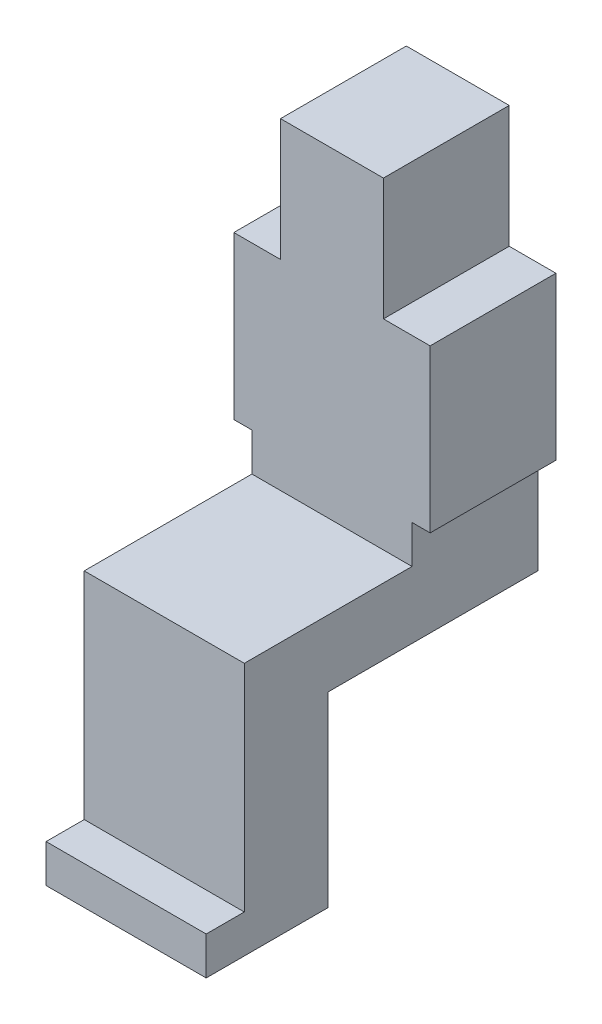
ISO-10303-21;
HEADER;
FILE_DESCRIPTION(('STEP AP214'),'2;1');
FILE_NAME('part.step','',(''),(''),'','','');
FILE_SCHEMA(('AUTOMOTIVE_DESIGN { 1 0 10303 214 1 1 1 1 }'));
ENDSEC;
DATA;
#1=APPLICATION_CONTEXT('core data for automotive mechanical design processes');
#2=APPLICATION_PROTOCOL_DEFINITION('international standard','automotive_design',2000,#1);
#3=PRODUCT_CONTEXT('',#1,'mechanical');
#4=PRODUCT('Part','Part','',(#3));
#5=PRODUCT_RELATED_PRODUCT_CATEGORY('part','',(#4));
#6=PRODUCT_DEFINITION_FORMATION('','',#4);
#7=PRODUCT_DEFINITION_CONTEXT('part definition',#1,'design');
#8=PRODUCT_DEFINITION('design','',#6,#7);
#9=PRODUCT_DEFINITION_SHAPE('','',#8);
#10=(LENGTH_UNIT() NAMED_UNIT(*) SI_UNIT(.MILLI.,.METRE.));
#11=(NAMED_UNIT(*) PLANE_ANGLE_UNIT() SI_UNIT($,.RADIAN.));
#12=(NAMED_UNIT(*) SI_UNIT($,.STERADIAN.) SOLID_ANGLE_UNIT());
#13=UNCERTAINTY_MEASURE_WITH_UNIT(LENGTH_MEASURE(1.E-05),#10,'distance_accuracy_value','');
#14=(GEOMETRIC_REPRESENTATION_CONTEXT(3) GLOBAL_UNCERTAINTY_ASSIGNED_CONTEXT((#13)) GLOBAL_UNIT_ASSIGNED_CONTEXT((#10,
#11,#12)) REPRESENTATION_CONTEXT('',''));
#15=CARTESIAN_POINT('',(0.,0.,0.));
#16=DIRECTION('',(0.,0.,1.));
#17=DIRECTION('',(1.,0.,0.));
#18=AXIS2_PLACEMENT_3D('',#15,#16,#17);
#19=CARTESIAN_POINT('',(210.,44.9999999999999,560.));
#20=DIRECTION('',(0.,0.,-1.));
#21=DIRECTION('',(-1.,0.,0.));
#22=AXIS2_PLACEMENT_3D('',#19,#20,#21);
#23=PLANE('',#22);
#24=DIRECTION('',(-1.,0.,0.));
#25=VECTOR('',#24,1.);
#26=CARTESIAN_POINT('',(-210.,-520.,560.));
#27=LINE('',#26,#25);
#28=CARTESIAN_POINT('',(210.,-520.,560.));
#29=VERTEX_POINT('',#28);
#30=CARTESIAN_POINT('',(-210.,-520.,560.));
#31=VERTEX_POINT('',#30);
#32=EDGE_CURVE('E50',#29,#31,#27,.T.);
#33=ORIENTED_EDGE('',*,*,#32,.F.);
#34=DIRECTION('',(0.,-1.,0.));
#35=VECTOR('',#34,1.);
#36=CARTESIAN_POINT('',(210.,44.9999999999999,560.));
#37=LINE('',#36,#35);
#38=CARTESIAN_POINT('',(210.,44.9999999999999,560.));
#39=VERTEX_POINT('',#38);
#40=EDGE_CURVE('E196',#39,#29,#37,.T.);
#41=ORIENTED_EDGE('',*,*,#40,.F.);
#42=DIRECTION('',(-1.,0.,0.));
#43=VECTOR('',#42,1.);
#44=CARTESIAN_POINT('',(210.,44.9999999999999,560.));
#45=LINE('',#44,#43);
#46=CARTESIAN_POINT('',(-210.,44.9999999999999,560.));
#47=VERTEX_POINT('',#46);
#48=EDGE_CURVE('E293',#39,#47,#45,.T.);
#49=ORIENTED_EDGE('',*,*,#48,.T.);
#50=DIRECTION('',(0.,-1.,0.));
#51=VECTOR('',#50,1.);
#52=CARTESIAN_POINT('',(-210.,44.9999999999999,560.));
#53=LINE('',#52,#51);
#54=EDGE_CURVE('E281',#47,#31,#53,.T.);
#55=ORIENTED_EDGE('',*,*,#54,.T.);
#56=EDGE_LOOP('',(#33,#41,#49,#55));
#57=FACE_BOUND('',#56,.T.);
#58=ADVANCED_FACE('F34',(#57),#23,.F.);
#59=CARTESIAN_POINT('',(210.,-130.,560.));
#60=DIRECTION('',(0.,1.,0.));
#61=DIRECTION('',(0.,0.,1.));
#62=AXIS2_PLACEMENT_3D('',#59,#60,#61);
#63=PLANE('',#62);
#64=DIRECTION('',(1.,0.,0.));
#65=VECTOR('',#64,1.);
#66=CARTESIAN_POINT('',(-210.,-130.,340.));
#67=LINE('',#66,#65);
#68=CARTESIAN_POINT('',(-210.,-130.,340.));
#69=VERTEX_POINT('',#68);
#70=CARTESIAN_POINT('',(210.,-130.,340.));
#71=VERTEX_POINT('',#70);
#72=EDGE_CURVE('E58',#69,#71,#67,.T.);
#73=ORIENTED_EDGE('',*,*,#72,.F.);
#74=DIRECTION('',(0.,0.,-1.));
#75=VECTOR('',#74,1.);
#76=CARTESIAN_POINT('',(-210.,-130.,560.));
#77=LINE('',#76,#75);
#78=CARTESIAN_POINT('',(-210.,-130.,-210.));
#79=VERTEX_POINT('',#78);
#80=EDGE_CURVE('E278',#69,#79,#77,.T.);
#81=ORIENTED_EDGE('',*,*,#80,.T.);
#82=DIRECTION('',(-1.,0.,0.));
#83=VECTOR('',#82,1.);
#84=CARTESIAN_POINT('',(210.,-130.,-210.));
#85=LINE('',#84,#83);
#86=CARTESIAN_POINT('',(210.,-130.,-210.));
#87=VERTEX_POINT('',#86);
#88=EDGE_CURVE('E42',#87,#79,#85,.T.);
#89=ORIENTED_EDGE('',*,*,#88,.F.);
#90=DIRECTION('',(0.,0.,-1.));
#91=VECTOR('',#90,1.);
#92=CARTESIAN_POINT('',(210.,-130.,560.));
#93=LINE('',#92,#91);
#94=EDGE_CURVE('E212',#71,#87,#93,.T.);
#95=ORIENTED_EDGE('',*,*,#94,.F.);
#96=EDGE_LOOP('',(#73,#81,#89,#95));
#97=FACE_BOUND('',#96,.T.);
#98=ADVANCED_FACE('F373',(#97),#63,.F.);
#99=CARTESIAN_POINT('',(210.,0.,0.));
#100=DIRECTION('',(1.,0.,0.));
#101=DIRECTION('',(0.,0.,-1.));
#102=AXIS2_PLACEMENT_3D('',#99,#100,#101);
#103=PLANE('',#102);
#104=DIRECTION('',(0.,1.,0.));
#105=VECTOR('',#104,1.);
#106=CARTESIAN_POINT('',(210.,-130.,-210.));
#107=LINE('',#106,#105);
#108=CARTESIAN_POINT('',(210.,145.,-210.));
#109=VERTEX_POINT('',#108);
#110=EDGE_CURVE('E352',#87,#109,#107,.T.);
#111=ORIENTED_EDGE('',*,*,#110,.T.);
#112=DIRECTION('',(0.,0.,1.));
#113=VECTOR('',#112,1.);
#114=CARTESIAN_POINT('',(210.,145.,0.));
#115=LINE('',#114,#113);
#116=CARTESIAN_POINT('',(210.,145.,120.));
#117=VERTEX_POINT('',#116);
#118=EDGE_CURVE('E251',#109,#117,#115,.T.);
#119=ORIENTED_EDGE('',*,*,#118,.T.);
#120=DIRECTION('',(0.,-1.,0.));
#121=VECTOR('',#120,1.);
#122=CARTESIAN_POINT('',(210.,570.,120.));
#123=LINE('',#122,#121);
#124=CARTESIAN_POINT('',(210.,45.,120.));
#125=VERTEX_POINT('',#124);
#126=EDGE_CURVE('E353',#117,#125,#123,.T.);
#127=ORIENTED_EDGE('',*,*,#126,.T.);
#128=DIRECTION('',(0.,0.,1.));
#129=VECTOR('',#128,1.);
#130=CARTESIAN_POINT('',(210.,45.,120.));
#131=LINE('',#130,#129);
#132=EDGE_CURVE('E297',#125,#39,#131,.T.);
#133=ORIENTED_EDGE('',*,*,#132,.T.);
#134=ORIENTED_EDGE('',*,*,#40,.T.);
#135=DIRECTION('',(0.,0.,-1.));
#136=VECTOR('',#135,1.);
#137=CARTESIAN_POINT('',(210.,-520.,660.));
#138=LINE('',#137,#136);
#139=CARTESIAN_POINT('',(210.,-520.,660.));
#140=VERTEX_POINT('',#139);
#141=EDGE_CURVE('E200',#140,#29,#138,.T.);
#142=ORIENTED_EDGE('',*,*,#141,.F.);
#143=DIRECTION('',(0.,1.,0.));
#144=VECTOR('',#143,1.);
#145=CARTESIAN_POINT('',(210.,-620.,660.));
#146=LINE('',#145,#144);
#147=CARTESIAN_POINT('',(210.,-620.,660.));
#148=VERTEX_POINT('',#147);
#149=EDGE_CURVE('E180',#148,#140,#146,.T.);
#150=ORIENTED_EDGE('',*,*,#149,.F.);
#151=DIRECTION('',(0.,0.,1.));
#152=VECTOR('',#151,1.);
#153=CARTESIAN_POINT('',(210.,-620.,560.));
#154=LINE('',#153,#152);
#155=CARTESIAN_POINT('',(210.,-620.,340.));
#156=VERTEX_POINT('',#155);
#157=EDGE_CURVE('E177',#156,#148,#154,.T.);
#158=ORIENTED_EDGE('',*,*,#157,.F.);
#159=DIRECTION('',(0.,1.,0.));
#160=VECTOR('',#159,1.);
#161=CARTESIAN_POINT('',(210.,-620.,340.));
#162=LINE('',#161,#160);
#163=EDGE_CURVE('E215',#156,#71,#162,.T.);
#164=ORIENTED_EDGE('',*,*,#163,.T.);
#165=ORIENTED_EDGE('',*,*,#94,.T.);
#166=EDGE_LOOP('',(#111,#119,#127,#133,#134,#142,#150,#158,#164,#165));
#167=FACE_BOUND('',#166,.T.);
#168=ADVANCED_FACE('F343',(#167),#103,.T.);
#169=CARTESIAN_POINT('',(-210.,0.,0.));
#170=DIRECTION('',(1.,0.,0.));
#171=DIRECTION('',(0.,0.,-1.));
#172=AXIS2_PLACEMENT_3D('',#169,#170,#171);
#173=PLANE('',#172);
#174=DIRECTION('',(0.,0.,1.));
#175=VECTOR('',#174,1.);
#176=CARTESIAN_POINT('',(-210.,145.,0.));
#177=LINE('',#176,#175);
#178=CARTESIAN_POINT('',(-210.,145.,-210.));
#179=VERTEX_POINT('',#178);
#180=CARTESIAN_POINT('',(-210.,145.,120.));
#181=VERTEX_POINT('',#180);
#182=EDGE_CURVE('E11',#179,#181,#177,.T.);
#183=ORIENTED_EDGE('',*,*,#182,.F.);
#184=DIRECTION('',(0.,1.,0.));
#185=VECTOR('',#184,1.);
#186=CARTESIAN_POINT('',(-210.,-130.,-210.));
#187=LINE('',#186,#185);
#188=EDGE_CURVE('E280',#79,#179,#187,.T.);
#189=ORIENTED_EDGE('',*,*,#188,.F.);
#190=ORIENTED_EDGE('',*,*,#80,.F.);
#191=DIRECTION('',(0.,1.,0.));
#192=VECTOR('',#191,1.);
#193=CARTESIAN_POINT('',(-210.,-620.,340.));
#194=LINE('',#193,#192);
#195=CARTESIAN_POINT('',(-210.,-620.,340.));
#196=VERTEX_POINT('',#195);
#197=EDGE_CURVE('E169',#196,#69,#194,.T.);
#198=ORIENTED_EDGE('',*,*,#197,.F.);
#199=DIRECTION('',(0.,0.,-1.));
#200=VECTOR('',#199,1.);
#201=CARTESIAN_POINT('',(-210.,-620.,560.));
#202=LINE('',#201,#200);
#203=CARTESIAN_POINT('',(-210.,-620.,660.));
#204=VERTEX_POINT('',#203);
#205=EDGE_CURVE('E161',#204,#196,#202,.T.);
#206=ORIENTED_EDGE('',*,*,#205,.F.);
#207=DIRECTION('',(0.,-1.,0.));
#208=VECTOR('',#207,1.);
#209=CARTESIAN_POINT('',(-210.,-620.,660.));
#210=LINE('',#209,#208);
#211=CARTESIAN_POINT('',(-210.,-520.,660.));
#212=VERTEX_POINT('',#211);
#213=EDGE_CURVE('E167',#212,#204,#210,.T.);
#214=ORIENTED_EDGE('',*,*,#213,.F.);
#215=DIRECTION('',(0.,0.,-1.));
#216=VECTOR('',#215,1.);
#217=CARTESIAN_POINT('',(-210.,-520.,660.));
#218=LINE('',#217,#216);
#219=EDGE_CURVE('E191',#212,#31,#218,.T.);
#220=ORIENTED_EDGE('',*,*,#219,.T.);
#221=ORIENTED_EDGE('',*,*,#54,.F.);
#222=DIRECTION('',(0.,0.,1.));
#223=VECTOR('',#222,1.);
#224=CARTESIAN_POINT('',(-210.,45.,120.));
#225=LINE('',#224,#223);
#226=CARTESIAN_POINT('',(-210.,45.,120.));
#227=VERTEX_POINT('',#226);
#228=EDGE_CURVE('E291',#227,#47,#225,.T.);
#229=ORIENTED_EDGE('',*,*,#228,.F.);
#230=DIRECTION('',(0.,-1.,0.));
#231=VECTOR('',#230,1.);
#232=CARTESIAN_POINT('',(-210.,570.,120.));
#233=LINE('',#232,#231);
#234=EDGE_CURVE('E289',#181,#227,#233,.T.);
#235=ORIENTED_EDGE('',*,*,#234,.F.);
#236=EDGE_LOOP('',(#183,#189,#190,#198,#206,#214,#220,#221,#229,#235));
#237=FACE_BOUND('',#236,.T.);
#238=ADVANCED_FACE('F164',(#237),#173,.F.);
#239=CARTESIAN_POINT('',(210.,570.,-210.));
#240=DIRECTION('',(0.,-1.,0.));
#241=DIRECTION('',(0.,0.,-1.));
#242=AXIS2_PLACEMENT_3D('',#239,#240,#241);
#243=PLANE('',#242);
#244=DIRECTION('',(0.,0.,1.));
#245=VECTOR('',#244,1.);
#246=CARTESIAN_POINT('',(-135.,570.,-210.));
#247=LINE('',#246,#245);
#248=CARTESIAN_POINT('',(-135.,570.,-210.));
#249=VERTEX_POINT('',#248);
#250=CARTESIAN_POINT('',(-135.,570.,120.));
#251=VERTEX_POINT('',#250);
#252=EDGE_CURVE('E253',#249,#251,#247,.T.);
#253=ORIENTED_EDGE('',*,*,#252,.F.);
#254=DIRECTION('',(-1.,0.,0.));
#255=VECTOR('',#254,1.);
#256=CARTESIAN_POINT('',(210.,570.,-210.));
#257=LINE('',#256,#255);
#258=CARTESIAN_POINT('',(-257.5,570.,-210.));
#259=VERTEX_POINT('',#258);
#260=EDGE_CURVE('E311',#249,#259,#257,.T.);
#261=ORIENTED_EDGE('',*,*,#260,.T.);
#262=DIRECTION('',(0.,0.,1.));
#263=VECTOR('',#262,1.);
#264=CARTESIAN_POINT('',(-257.5,570.,120.));
#265=LINE('',#264,#263);
#266=CARTESIAN_POINT('',(-257.5,570.,120.));
#267=VERTEX_POINT('',#266);
#268=EDGE_CURVE('E224',#259,#267,#265,.T.);
#269=ORIENTED_EDGE('',*,*,#268,.T.);
#270=DIRECTION('',(-1.,0.,0.));
#271=VECTOR('',#270,1.);
#272=CARTESIAN_POINT('',(210.,570.,120.));
#273=LINE('',#272,#271);
#274=EDGE_CURVE('E300',#251,#267,#273,.T.);
#275=ORIENTED_EDGE('',*,*,#274,.F.);
#276=EDGE_LOOP('',(#253,#261,#269,#275));
#277=FACE_BOUND('',#276,.T.);
#278=ADVANCED_FACE('F394',(#277),#243,.F.);
#279=DIRECTION('',(0.,0.,-1.));
#280=VECTOR('',#279,1.);
#281=CARTESIAN_POINT('',(135.,570.,-210.));
#282=LINE('',#281,#280);
#283=CARTESIAN_POINT('',(135.,570.,120.));
#284=VERTEX_POINT('',#283);
#285=CARTESIAN_POINT('',(135.,570.,-210.));
#286=VERTEX_POINT('',#285);
#287=EDGE_CURVE('E258',#284,#286,#282,.T.);
#288=ORIENTED_EDGE('',*,*,#287,.F.);
#289=CARTESIAN_POINT('',(257.5,570.,120.));
#290=VERTEX_POINT('',#289);
#291=EDGE_CURVE('E309',#290,#284,#273,.T.);
#292=ORIENTED_EDGE('',*,*,#291,.F.);
#293=DIRECTION('',(0.,0.,1.));
#294=VECTOR('',#293,1.);
#295=CARTESIAN_POINT('',(257.5,570.,120.));
#296=LINE('',#295,#294);
#297=CARTESIAN_POINT('',(257.5,570.,-210.));
#298=VERTEX_POINT('',#297);
#299=EDGE_CURVE('E229',#298,#290,#296,.T.);
#300=ORIENTED_EDGE('',*,*,#299,.F.);
#301=EDGE_CURVE('E313',#298,#286,#257,.T.);
#302=ORIENTED_EDGE('',*,*,#301,.T.);
#303=EDGE_LOOP('',(#288,#292,#300,#302));
#304=FACE_BOUND('',#303,.T.);
#305=ADVANCED_FACE('F382',(#304),#243,.F.);
#306=CARTESIAN_POINT('',(210.,-130.,-210.));
#307=DIRECTION('',(0.,0.,1.));
#308=DIRECTION('',(0.,-1.,0.));
#309=AXIS2_PLACEMENT_3D('',#306,#307,#308);
#310=PLANE('',#309);
#311=ORIENTED_EDGE('',*,*,#301,.F.);
#312=DIRECTION('',(0.,1.,0.));
#313=VECTOR('',#312,1.);
#314=CARTESIAN_POINT('',(257.5,570.,-210.));
#315=LINE('',#314,#313);
#316=CARTESIAN_POINT('',(257.5,145.,-210.));
#317=VERTEX_POINT('',#316);
#318=EDGE_CURVE('E226',#317,#298,#315,.T.);
#319=ORIENTED_EDGE('',*,*,#318,.F.);
#320=DIRECTION('',(-1.,0.,0.));
#321=VECTOR('',#320,1.);
#322=CARTESIAN_POINT('',(257.5,145.,-210.));
#323=LINE('',#322,#321);
#324=EDGE_CURVE('E244',#317,#109,#323,.T.);
#325=ORIENTED_EDGE('',*,*,#324,.T.);
#326=ORIENTED_EDGE('',*,*,#110,.F.);
#327=ORIENTED_EDGE('',*,*,#88,.T.);
#328=ORIENTED_EDGE('',*,*,#188,.T.);
#329=CARTESIAN_POINT('',(-257.5,145.,-210.));
#330=VERTEX_POINT('',#329);
#331=EDGE_CURVE('E232',#179,#330,#323,.T.);
#332=ORIENTED_EDGE('',*,*,#331,.T.);
#333=DIRECTION('',(0.,1.,0.));
#334=VECTOR('',#333,1.);
#335=CARTESIAN_POINT('',(-257.5,570.,-210.));
#336=LINE('',#335,#334);
#337=EDGE_CURVE('E239',#330,#259,#336,.T.);
#338=ORIENTED_EDGE('',*,*,#337,.T.);
#339=ORIENTED_EDGE('',*,*,#260,.F.);
#340=DIRECTION('',(0.,-1.,0.));
#341=VECTOR('',#340,1.);
#342=CARTESIAN_POINT('',(-135.,890.,-210.));
#343=LINE('',#342,#341);
#344=CARTESIAN_POINT('',(-135.,890.,-210.));
#345=VERTEX_POINT('',#344);
#346=EDGE_CURVE('E264',#345,#249,#343,.T.);
#347=ORIENTED_EDGE('',*,*,#346,.F.);
#348=DIRECTION('',(-1.,0.,0.));
#349=VECTOR('',#348,1.);
#350=CARTESIAN_POINT('',(-135.,890.,-210.));
#351=LINE('',#350,#349);
#352=CARTESIAN_POINT('',(135.,890.,-210.));
#353=VERTEX_POINT('',#352);
#354=EDGE_CURVE('E262',#353,#345,#351,.T.);
#355=ORIENTED_EDGE('',*,*,#354,.F.);
#356=DIRECTION('',(0.,-1.,0.));
#357=VECTOR('',#356,1.);
#358=CARTESIAN_POINT('',(135.,890.,-210.));
#359=LINE('',#358,#357);
#360=EDGE_CURVE('E276',#353,#286,#359,.T.);
#361=ORIENTED_EDGE('',*,*,#360,.T.);
#362=EDGE_LOOP('',(#311,#319,#325,#326,#327,#328,#332,#338,#339,#347,#355,#361));
#363=FACE_BOUND('',#362,.T.);
#364=ADVANCED_FACE('F371',(#363),#310,.F.);
#365=CARTESIAN_POINT('',(210.,570.,120.));
#366=DIRECTION('',(0.,0.,-1.));
#367=DIRECTION('',(0.,1.,0.));
#368=AXIS2_PLACEMENT_3D('',#365,#366,#367);
#369=PLANE('',#368);
#370=ORIENTED_EDGE('',*,*,#274,.T.);
#371=DIRECTION('',(0.,-1.,0.));
#372=VECTOR('',#371,1.);
#373=CARTESIAN_POINT('',(-257.5,570.,120.));
#374=LINE('',#373,#372);
#375=CARTESIAN_POINT('',(-257.5,145.,120.));
#376=VERTEX_POINT('',#375);
#377=EDGE_CURVE('E233',#267,#376,#374,.T.);
#378=ORIENTED_EDGE('',*,*,#377,.T.);
#379=DIRECTION('',(-1.,0.,0.));
#380=VECTOR('',#379,1.);
#381=CARTESIAN_POINT('',(257.5,145.,120.));
#382=LINE('',#381,#380);
#383=EDGE_CURVE('E247',#181,#376,#382,.T.);
#384=ORIENTED_EDGE('',*,*,#383,.F.);
#385=ORIENTED_EDGE('',*,*,#234,.T.);
#386=DIRECTION('',(-1.,0.,0.));
#387=VECTOR('',#386,1.);
#388=CARTESIAN_POINT('',(210.,45.,120.));
#389=LINE('',#388,#387);
#390=EDGE_CURVE('E296',#125,#227,#389,.T.);
#391=ORIENTED_EDGE('',*,*,#390,.F.);
#392=ORIENTED_EDGE('',*,*,#126,.F.);
#393=CARTESIAN_POINT('',(257.5,145.,120.));
#394=VERTEX_POINT('',#393);
#395=EDGE_CURVE('E248',#394,#117,#382,.T.);
#396=ORIENTED_EDGE('',*,*,#395,.F.);
#397=DIRECTION('',(0.,-1.,0.));
#398=VECTOR('',#397,1.);
#399=CARTESIAN_POINT('',(257.5,570.,120.));
#400=LINE('',#399,#398);
#401=EDGE_CURVE('E220',#290,#394,#400,.T.);
#402=ORIENTED_EDGE('',*,*,#401,.F.);
#403=ORIENTED_EDGE('',*,*,#291,.T.);
#404=DIRECTION('',(0.,-1.,0.));
#405=VECTOR('',#404,1.);
#406=CARTESIAN_POINT('',(135.,890.,120.));
#407=LINE('',#406,#405);
#408=CARTESIAN_POINT('',(135.,890.,120.));
#409=VERTEX_POINT('',#408);
#410=EDGE_CURVE('E326',#409,#284,#407,.T.);
#411=ORIENTED_EDGE('',*,*,#410,.F.);
#412=DIRECTION('',(1.,0.,0.));
#413=VECTOR('',#412,1.);
#414=CARTESIAN_POINT('',(-135.,890.,120.));
#415=LINE('',#414,#413);
#416=CARTESIAN_POINT('',(-135.,890.,120.));
#417=VERTEX_POINT('',#416);
#418=EDGE_CURVE('E257',#417,#409,#415,.T.);
#419=ORIENTED_EDGE('',*,*,#418,.F.);
#420=DIRECTION('',(0.,-1.,0.));
#421=VECTOR('',#420,1.);
#422=CARTESIAN_POINT('',(-135.,890.,120.));
#423=LINE('',#422,#421);
#424=EDGE_CURVE('E331',#417,#251,#423,.T.);
#425=ORIENTED_EDGE('',*,*,#424,.T.);
#426=EDGE_LOOP('',(#370,#378,#384,#385,#391,#392,#396,#402,#403,#411,#419,#425));
#427=FACE_BOUND('',#426,.T.);
#428=ADVANCED_FACE('F360',(#427),#369,.F.);
#429=CARTESIAN_POINT('',(210.,45.,120.));
#430=DIRECTION('',(0.,-1.,0.));
#431=DIRECTION('',(0.,0.,-1.));
#432=AXIS2_PLACEMENT_3D('',#429,#430,#431);
#433=PLANE('',#432);
#434=ORIENTED_EDGE('',*,*,#228,.T.);
#435=ORIENTED_EDGE('',*,*,#48,.F.);
#436=ORIENTED_EDGE('',*,*,#132,.F.);
#437=ORIENTED_EDGE('',*,*,#390,.T.);
#438=EDGE_LOOP('',(#434,#435,#436,#437));
#439=FACE_BOUND('',#438,.T.);
#440=ADVANCED_FACE('F349',(#439),#433,.F.);
#441=CARTESIAN_POINT('',(-135.,890.,-210.));
#442=DIRECTION('',(1.,0.,0.));
#443=DIRECTION('',(0.,0.,-1.));
#444=AXIS2_PLACEMENT_3D('',#441,#442,#443);
#445=PLANE('',#444);
#446=ORIENTED_EDGE('',*,*,#252,.T.);
#447=ORIENTED_EDGE('',*,*,#424,.F.);
#448=DIRECTION('',(0.,0.,1.));
#449=VECTOR('',#448,1.);
#450=CARTESIAN_POINT('',(-135.,890.,-210.));
#451=LINE('',#450,#449);
#452=EDGE_CURVE('E254',#345,#417,#451,.T.);
#453=ORIENTED_EDGE('',*,*,#452,.F.);
#454=ORIENTED_EDGE('',*,*,#346,.T.);
#455=EDGE_LOOP('',(#446,#447,#453,#454));
#456=FACE_BOUND('',#455,.T.);
#457=ADVANCED_FACE('F392',(#456),#445,.F.);
#458=CARTESIAN_POINT('',(135.,890.,-210.));
#459=DIRECTION('',(-1.,0.,0.));
#460=DIRECTION('',(0.,0.,1.));
#461=AXIS2_PLACEMENT_3D('',#458,#459,#460);
#462=PLANE('',#461);
#463=ORIENTED_EDGE('',*,*,#287,.T.);
#464=ORIENTED_EDGE('',*,*,#360,.F.);
#465=DIRECTION('',(0.,0.,-1.));
#466=VECTOR('',#465,1.);
#467=CARTESIAN_POINT('',(135.,890.,-210.));
#468=LINE('',#467,#466);
#469=EDGE_CURVE('E260',#409,#353,#468,.T.);
#470=ORIENTED_EDGE('',*,*,#469,.F.);
#471=ORIENTED_EDGE('',*,*,#410,.T.);
#472=EDGE_LOOP('',(#463,#464,#470,#471));
#473=FACE_BOUND('',#472,.T.);
#474=ADVANCED_FACE('F385',(#473),#462,.F.);
#475=CARTESIAN_POINT('',(0.,890.,0.));
#476=DIRECTION('',(0.,1.,0.));
#477=DIRECTION('',(0.,0.,1.));
#478=AXIS2_PLACEMENT_3D('',#475,#476,#477);
#479=PLANE('',#478);
#480=ORIENTED_EDGE('',*,*,#452,.T.);
#481=ORIENTED_EDGE('',*,*,#418,.T.);
#482=ORIENTED_EDGE('',*,*,#469,.T.);
#483=ORIENTED_EDGE('',*,*,#354,.T.);
#484=EDGE_LOOP('',(#480,#481,#482,#483));
#485=FACE_BOUND('',#484,.T.);
#486=ADVANCED_FACE('F390',(#485),#479,.T.);
#487=CARTESIAN_POINT('',(-257.5,0.,0.));
#488=DIRECTION('',(1.,0.,0.));
#489=DIRECTION('',(0.,0.,-1.));
#490=AXIS2_PLACEMENT_3D('',#487,#488,#489);
#491=PLANE('',#490);
#492=ORIENTED_EDGE('',*,*,#377,.F.);
#493=ORIENTED_EDGE('',*,*,#268,.F.);
#494=ORIENTED_EDGE('',*,*,#337,.F.);
#495=DIRECTION('',(0.,0.,-1.));
#496=VECTOR('',#495,1.);
#497=CARTESIAN_POINT('',(-257.5,145.,120.));
#498=LINE('',#497,#496);
#499=EDGE_CURVE('E236',#376,#330,#498,.T.);
#500=ORIENTED_EDGE('',*,*,#499,.F.);
#501=EDGE_LOOP('',(#492,#493,#494,#500));
#502=FACE_BOUND('',#501,.T.);
#503=ADVANCED_FACE('F368',(#502),#491,.F.);
#504=CARTESIAN_POINT('',(257.5,145.,120.));
#505=DIRECTION('',(0.,1.,0.));
#506=DIRECTION('',(0.,0.,1.));
#507=AXIS2_PLACEMENT_3D('',#504,#505,#506);
#508=PLANE('',#507);
#509=ORIENTED_EDGE('',*,*,#331,.F.);
#510=ORIENTED_EDGE('',*,*,#182,.T.);
#511=ORIENTED_EDGE('',*,*,#383,.T.);
#512=ORIENTED_EDGE('',*,*,#499,.T.);
#513=EDGE_LOOP('',(#509,#510,#511,#512));
#514=FACE_BOUND('',#513,.T.);
#515=ADVANCED_FACE('F365',(#514),#508,.F.);
#516=ORIENTED_EDGE('',*,*,#118,.F.);
#517=ORIENTED_EDGE('',*,*,#324,.F.);
#518=DIRECTION('',(0.,0.,-1.));
#519=VECTOR('',#518,1.);
#520=CARTESIAN_POINT('',(257.5,145.,120.));
#521=LINE('',#520,#519);
#522=EDGE_CURVE('E223',#394,#317,#521,.T.);
#523=ORIENTED_EDGE('',*,*,#522,.F.);
#524=ORIENTED_EDGE('',*,*,#395,.T.);
#525=EDGE_LOOP('',(#516,#517,#523,#524));
#526=FACE_BOUND('',#525,.T.);
#527=ADVANCED_FACE('F377',(#526),#508,.F.);
#528=CARTESIAN_POINT('',(257.5,0.,0.));
#529=DIRECTION('',(1.,0.,0.));
#530=DIRECTION('',(0.,0.,-1.));
#531=AXIS2_PLACEMENT_3D('',#528,#529,#530);
#532=PLANE('',#531);
#533=ORIENTED_EDGE('',*,*,#401,.T.);
#534=ORIENTED_EDGE('',*,*,#522,.T.);
#535=ORIENTED_EDGE('',*,*,#318,.T.);
#536=ORIENTED_EDGE('',*,*,#299,.T.);
#537=EDGE_LOOP('',(#533,#534,#535,#536));
#538=FACE_BOUND('',#537,.T.);
#539=ADVANCED_FACE('F381',(#538),#532,.T.);
#540=CARTESIAN_POINT('',(-210.,-620.,340.));
#541=DIRECTION('',(0.,0.,1.));
#542=DIRECTION('',(1.,0.,0.));
#543=AXIS2_PLACEMENT_3D('',#540,#541,#542);
#544=PLANE('',#543);
#545=ORIENTED_EDGE('',*,*,#72,.T.);
#546=ORIENTED_EDGE('',*,*,#163,.F.);
#547=DIRECTION('',(1.,0.,0.));
#548=VECTOR('',#547,1.);
#549=CARTESIAN_POINT('',(-210.,-620.,340.));
#550=LINE('',#549,#548);
#551=EDGE_CURVE('E171',#196,#156,#550,.T.);
#552=ORIENTED_EDGE('',*,*,#551,.F.);
#553=ORIENTED_EDGE('',*,*,#197,.T.);
#554=EDGE_LOOP('',(#545,#546,#552,#553));
#555=FACE_BOUND('',#554,.T.);
#556=ADVANCED_FACE('F342',(#555),#544,.F.);
#557=CARTESIAN_POINT('',(0.,-620.,0.));
#558=DIRECTION('',(0.,-1.,0.));
#559=DIRECTION('',(0.,0.,-1.));
#560=AXIS2_PLACEMENT_3D('',#557,#558,#559);
#561=PLANE('',#560);
#562=ORIENTED_EDGE('',*,*,#205,.T.);
#563=ORIENTED_EDGE('',*,*,#551,.T.);
#564=ORIENTED_EDGE('',*,*,#157,.T.);
#565=DIRECTION('',(1.,0.,0.));
#566=VECTOR('',#565,1.);
#567=CARTESIAN_POINT('',(-210.,-620.,660.));
#568=LINE('',#567,#566);
#569=EDGE_CURVE('E174',#204,#148,#568,.T.);
#570=ORIENTED_EDGE('',*,*,#569,.F.);
#571=EDGE_LOOP('',(#562,#563,#564,#570));
#572=FACE_BOUND('',#571,.T.);
#573=ADVANCED_FACE('F175',(#572),#561,.T.);
#574=CARTESIAN_POINT('',(-210.,-520.,660.));
#575=DIRECTION('',(0.,-1.,0.));
#576=DIRECTION('',(0.,0.,-1.));
#577=AXIS2_PLACEMENT_3D('',#574,#575,#576);
#578=PLANE('',#577);
#579=ORIENTED_EDGE('',*,*,#32,.T.);
#580=ORIENTED_EDGE('',*,*,#219,.F.);
#581=DIRECTION('',(-1.,0.,0.));
#582=VECTOR('',#581,1.);
#583=CARTESIAN_POINT('',(-210.,-520.,660.));
#584=LINE('',#583,#582);
#585=EDGE_CURVE('E184',#140,#212,#584,.T.);
#586=ORIENTED_EDGE('',*,*,#585,.F.);
#587=ORIENTED_EDGE('',*,*,#141,.T.);
#588=EDGE_LOOP('',(#579,#580,#586,#587));
#589=FACE_BOUND('',#588,.T.);
#590=ADVANCED_FACE('F344',(#589),#578,.F.);
#591=CARTESIAN_POINT('',(0.,0.,660.));
#592=DIRECTION('',(0.,0.,-1.));
#593=DIRECTION('',(-1.,0.,0.));
#594=AXIS2_PLACEMENT_3D('',#591,#592,#593);
#595=PLANE('',#594);
#596=ORIENTED_EDGE('',*,*,#213,.T.);
#597=ORIENTED_EDGE('',*,*,#569,.T.);
#598=ORIENTED_EDGE('',*,*,#149,.T.);
#599=ORIENTED_EDGE('',*,*,#585,.T.);
#600=EDGE_LOOP('',(#596,#597,#598,#599));
#601=FACE_BOUND('',#600,.T.);
#602=ADVANCED_FACE('F182',(#601),#595,.F.);
#603=CLOSED_SHELL('',(#58,#98,#168,#238,#278,#305,#364,#428,#440,#457,#474,#486,#503,#515,#527,
#539,#556,#573,#590,#602));
#604=MANIFOLD_SOLID_BREP('B2',#603);
#605=ADVANCED_BREP_SHAPE_REPRESENTATION('',(#18,#604),#14);
#606=SHAPE_DEFINITION_REPRESENTATION(#9,#605);
ENDSEC;
END-ISO-10303-21;
